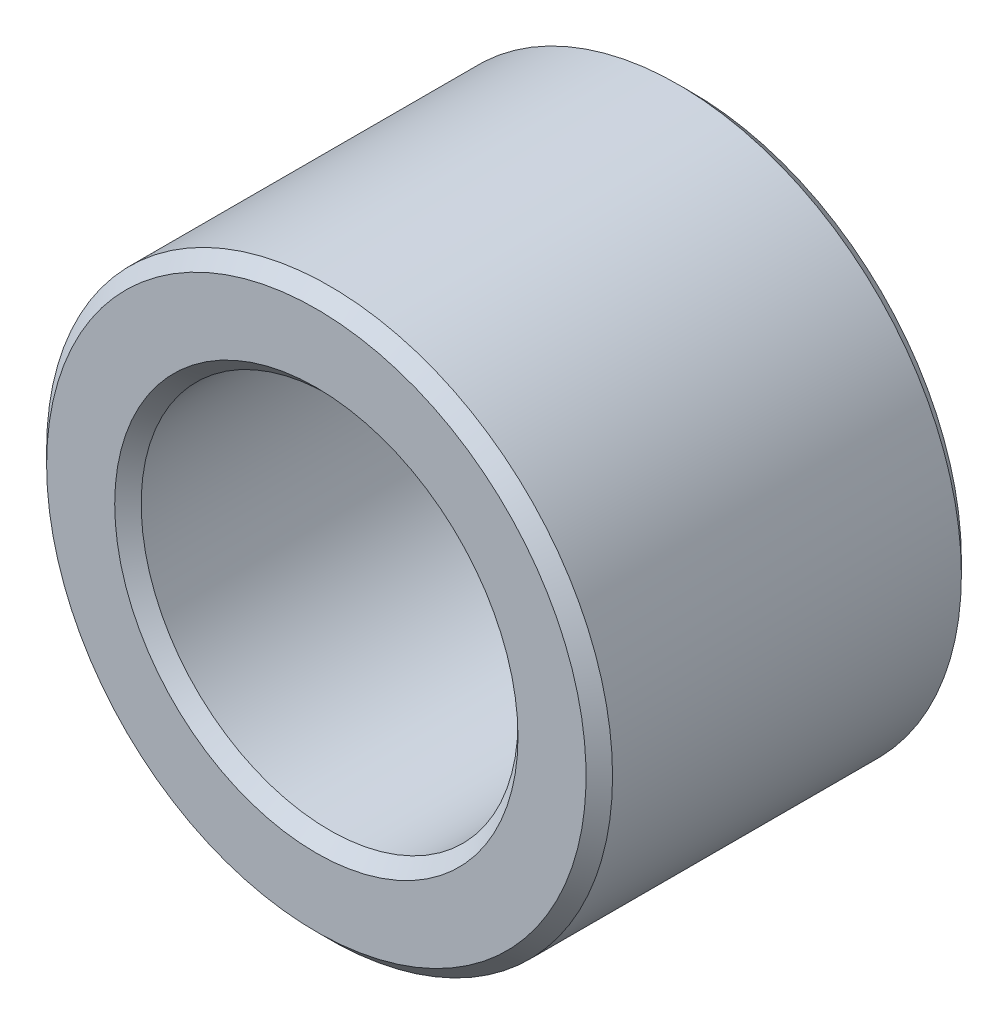
ISO-10303-21;
HEADER;
FILE_DESCRIPTION(('STEP AP214'),'2;1');
FILE_NAME('part.step','',(''),(''),'','','');
FILE_SCHEMA(('AUTOMOTIVE_DESIGN { 1 0 10303 214 1 1 1 1 }'));
ENDSEC;
DATA;
#1=APPLICATION_CONTEXT('core data for automotive mechanical design processes');
#2=APPLICATION_PROTOCOL_DEFINITION('international standard','automotive_design',2000,#1);
#3=PRODUCT_CONTEXT('',#1,'mechanical');
#4=PRODUCT('Part','Part','',(#3));
#5=PRODUCT_RELATED_PRODUCT_CATEGORY('part','',(#4));
#6=PRODUCT_DEFINITION_FORMATION('','',#4);
#7=PRODUCT_DEFINITION_CONTEXT('part definition',#1,'design');
#8=PRODUCT_DEFINITION('design','',#6,#7);
#9=PRODUCT_DEFINITION_SHAPE('','',#8);
#10=(LENGTH_UNIT() NAMED_UNIT(*) SI_UNIT(.MILLI.,.METRE.));
#11=(NAMED_UNIT(*) PLANE_ANGLE_UNIT() SI_UNIT($,.RADIAN.));
#12=(NAMED_UNIT(*) SI_UNIT($,.STERADIAN.) SOLID_ANGLE_UNIT());
#13=UNCERTAINTY_MEASURE_WITH_UNIT(LENGTH_MEASURE(1.E-05),#10,'distance_accuracy_value','');
#14=(GEOMETRIC_REPRESENTATION_CONTEXT(3) GLOBAL_UNCERTAINTY_ASSIGNED_CONTEXT((#13)) GLOBAL_UNIT_ASSIGNED_CONTEXT((#10,
#11,#12)) REPRESENTATION_CONTEXT('',''));
#15=CARTESIAN_POINT('',(0.,0.,0.));
#16=DIRECTION('',(0.,0.,1.));
#17=DIRECTION('',(1.,0.,0.));
#18=AXIS2_PLACEMENT_3D('',#15,#16,#17);
#19=CARTESIAN_POINT('',(0.,0.,-3.175));
#20=DIRECTION('',(0.,0.,1.));
#21=DIRECTION('',(1.,0.,0.));
#22=AXIS2_PLACEMENT_3D('',#19,#20,#21);
#23=CYLINDRICAL_SURFACE('',#22,4.7879);
#24=CARTESIAN_POINT('',(0.,0.,-2.950972));
#25=DIRECTION('',(0.,0.,1.));
#26=DIRECTION('',(1.,0.,0.));
#27=AXIS2_PLACEMENT_3D('',#24,#25,#26);
#28=CIRCLE('',#27,4.7879);
#29=CARTESIAN_POINT('',(4.7879,0.,-2.950972));
#30=VERTEX_POINT('',#29);
#31=EDGE_CURVE('E76',#30,#30,#28,.T.);
#32=ORIENTED_EDGE('',*,*,#31,.T.);
#33=EDGE_LOOP('',(#32));
#34=FACE_BOUND('',#33,.T.);
#35=CARTESIAN_POINT('',(0.,0.,2.95097199999999));
#36=DIRECTION('',(0.,0.,1.));
#37=DIRECTION('',(1.,0.,0.));
#38=AXIS2_PLACEMENT_3D('',#35,#36,#37);
#39=CIRCLE('',#38,4.7879);
#40=CARTESIAN_POINT('',(-4.7879,0.,2.95097199999999));
#41=VERTEX_POINT('',#40);
#42=EDGE_CURVE('E82',#41,#41,#39,.F.);
#43=ORIENTED_EDGE('',*,*,#42,.T.);
#44=EDGE_LOOP('',(#43));
#45=FACE_BOUND('',#44,.T.);
#46=ADVANCED_FACE('F43',(#34,#45),#23,.T.);
#47=CARTESIAN_POINT('',(0.,0.,-3.175));
#48=DIRECTION('',(0.,0.,1.));
#49=DIRECTION('',(1.,0.,0.));
#50=AXIS2_PLACEMENT_3D('',#47,#48,#49);
#51=PLANE('',#50);
#52=CARTESIAN_POINT('',(0.,0.,-3.175));
#53=DIRECTION('',(0.,0.,1.));
#54=DIRECTION('',(1.,0.,0.));
#55=AXIS2_PLACEMENT_3D('',#52,#53,#54);
#56=CIRCLE('',#55,4.563872);
#57=CARTESIAN_POINT('',(4.563872,0.,-3.175));
#58=VERTEX_POINT('',#57);
#59=EDGE_CURVE('E67',#58,#58,#56,.F.);
#60=ORIENTED_EDGE('',*,*,#59,.T.);
#61=EDGE_LOOP('',(#60));
#62=FACE_BOUND('',#61,.T.);
#63=CARTESIAN_POINT('',(0.,0.,-3.175));
#64=DIRECTION('',(0.,0.,1.));
#65=DIRECTION('',(1.,0.,0.));
#66=AXIS2_PLACEMENT_3D('',#63,#64,#65);
#67=CIRCLE('',#66,3.411728);
#68=CARTESIAN_POINT('',(3.411728,0.,-3.175));
#69=VERTEX_POINT('',#68);
#70=EDGE_CURVE('E72',#69,#69,#67,.T.);
#71=ORIENTED_EDGE('',*,*,#70,.T.);
#72=EDGE_LOOP('',(#71));
#73=FACE_BOUND('',#72,.T.);
#74=ADVANCED_FACE('F96',(#62,#73),#51,.F.);
#75=CARTESIAN_POINT('',(0.,0.,-3.175));
#76=DIRECTION('',(0.,0.,1.));
#77=DIRECTION('',(1.,0.,0.));
#78=AXIS2_PLACEMENT_3D('',#75,#76,#77);
#79=CYLINDRICAL_SURFACE('',#78,3.1877);
#80=CARTESIAN_POINT('',(0.,0.,-2.950972));
#81=DIRECTION('',(0.,0.,1.));
#82=DIRECTION('',(1.,0.,0.));
#83=AXIS2_PLACEMENT_3D('',#80,#81,#82);
#84=CIRCLE('',#83,3.1877);
#85=CARTESIAN_POINT('',(3.1877,0.,-2.950972));
#86=VERTEX_POINT('',#85);
#87=EDGE_CURVE('E59',#86,#86,#84,.F.);
#88=ORIENTED_EDGE('',*,*,#87,.T.);
#89=EDGE_LOOP('',(#88));
#90=FACE_BOUND('',#89,.T.);
#91=CARTESIAN_POINT('',(0.,0.,2.950972));
#92=DIRECTION('',(0.,0.,1.));
#93=DIRECTION('',(1.,0.,0.));
#94=AXIS2_PLACEMENT_3D('',#91,#92,#93);
#95=CIRCLE('',#94,3.1877);
#96=CARTESIAN_POINT('',(3.1877,0.,2.950972));
#97=VERTEX_POINT('',#96);
#98=EDGE_CURVE('E63',#97,#97,#95,.T.);
#99=ORIENTED_EDGE('',*,*,#98,.T.);
#100=EDGE_LOOP('',(#99));
#101=FACE_BOUND('',#100,.T.);
#102=ADVANCED_FACE('F104',(#90,#101),#79,.F.);
#103=CARTESIAN_POINT('',(0.,0.,3.175));
#104=DIRECTION('',(0.,0.,1.));
#105=DIRECTION('',(1.,0.,0.));
#106=AXIS2_PLACEMENT_3D('',#103,#104,#105);
#107=PLANE('',#106);
#108=CARTESIAN_POINT('',(0.,0.,3.175));
#109=DIRECTION('',(0.,0.,1.));
#110=DIRECTION('',(1.,0.,0.));
#111=AXIS2_PLACEMENT_3D('',#108,#109,#110);
#112=CIRCLE('',#111,3.411728);
#113=CARTESIAN_POINT('',(3.411728,0.,3.175));
#114=VERTEX_POINT('',#113);
#115=EDGE_CURVE('E10',#114,#114,#112,.F.);
#116=ORIENTED_EDGE('',*,*,#115,.T.);
#117=EDGE_LOOP('',(#116));
#118=FACE_BOUND('',#117,.T.);
#119=CARTESIAN_POINT('',(0.,0.,3.175));
#120=DIRECTION('',(0.,0.,1.));
#121=DIRECTION('',(1.,0.,0.));
#122=AXIS2_PLACEMENT_3D('',#119,#120,#121);
#123=CIRCLE('',#122,4.56387199999999);
#124=CARTESIAN_POINT('',(-4.56387199999999,0.,3.175));
#125=VERTEX_POINT('',#124);
#126=EDGE_CURVE('E55',#125,#125,#123,.T.);
#127=ORIENTED_EDGE('',*,*,#126,.T.);
#128=EDGE_LOOP('',(#127));
#129=FACE_BOUND('',#128,.T.);
#130=ADVANCED_FACE('F116',(#118,#129),#107,.T.);
#131=CARTESIAN_POINT('',(0.,0.,-2.950972));
#132=DIRECTION('',(0.,0.,1.));
#133=DIRECTION('',(1.,0.,0.));
#134=AXIS2_PLACEMENT_3D('',#131,#132,#133);
#135=CONICAL_SURFACE('',#134,4.7879,0.785398163397448);
#136=ORIENTED_EDGE('',*,*,#59,.F.);
#137=EDGE_LOOP('',(#136));
#138=FACE_BOUND('',#137,.T.);
#139=ORIENTED_EDGE('',*,*,#31,.F.);
#140=EDGE_LOOP('',(#139));
#141=FACE_BOUND('',#140,.T.);
#142=ADVANCED_FACE('F109',(#138,#141),#135,.T.);
#143=CARTESIAN_POINT('',(0.,0.,-3.175));
#144=DIRECTION('',(0.,0.,-1.));
#145=DIRECTION('',(-1.,0.,0.));
#146=AXIS2_PLACEMENT_3D('',#143,#144,#145);
#147=CONICAL_SURFACE('',#146,3.411728,0.785398163397447);
#148=ORIENTED_EDGE('',*,*,#87,.F.);
#149=EDGE_LOOP('',(#148));
#150=FACE_BOUND('',#149,.T.);
#151=ORIENTED_EDGE('',*,*,#70,.F.);
#152=EDGE_LOOP('',(#151));
#153=FACE_BOUND('',#152,.T.);
#154=ADVANCED_FACE('F94',(#150,#153),#147,.F.);
#155=CARTESIAN_POINT('',(0.,0.,2.950972));
#156=DIRECTION('',(0.,0.,1.));
#157=DIRECTION('',(1.,0.,0.));
#158=AXIS2_PLACEMENT_3D('',#155,#156,#157);
#159=CONICAL_SURFACE('',#158,3.1877,0.78539816339745);
#160=CARTESIAN_POINT('',(3.411728,0.,3.175));
#161=CARTESIAN_POINT('',(3.409394375,0.,3.172666375));
#162=CARTESIAN_POINT('',(3.40706075,0.,3.17033275));
#163=CARTESIAN_POINT('',(3.4023935,0.,3.1656655));
#164=CARTESIAN_POINT('',(3.400059875,0.,3.163331875));
#165=CARTESIAN_POINT('',(3.395392625,0.,3.158664625));
#166=CARTESIAN_POINT('',(3.393059,0.,3.156331));
#167=CARTESIAN_POINT('',(3.38839175,0.,3.15166375));
#168=CARTESIAN_POINT('',(3.386058125,0.,3.149330125));
#169=CARTESIAN_POINT('',(3.381390875,0.,3.144662875));
#170=CARTESIAN_POINT('',(3.37905725,0.,3.14232925));
#171=CARTESIAN_POINT('',(3.37439,0.,3.137662));
#172=CARTESIAN_POINT('',(3.372056375,0.,3.135328375));
#173=CARTESIAN_POINT('',(3.367389125,0.,3.130661125));
#174=CARTESIAN_POINT('',(3.3650555,0.,3.1283275));
#175=CARTESIAN_POINT('',(3.36038825,0.,3.12366025));
#176=CARTESIAN_POINT('',(3.358054625,0.,3.121326625));
#177=CARTESIAN_POINT('',(3.353387375,0.,3.116659375));
#178=CARTESIAN_POINT('',(3.35105375,0.,3.11432575));
#179=CARTESIAN_POINT('',(3.3463865,0.,3.1096585));
#180=CARTESIAN_POINT('',(3.344052875,0.,3.107324875));
#181=CARTESIAN_POINT('',(3.339385625,0.,3.102657625));
#182=CARTESIAN_POINT('',(3.337052,0.,3.100324));
#183=CARTESIAN_POINT('',(3.33238475,0.,3.09565675));
#184=CARTESIAN_POINT('',(3.330051125,0.,3.093323125));
#185=CARTESIAN_POINT('',(3.325383875,0.,3.088655875));
#186=CARTESIAN_POINT('',(3.32305025,0.,3.08632225));
#187=CARTESIAN_POINT('',(3.318383,0.,3.081655));
#188=CARTESIAN_POINT('',(3.316049375,0.,3.079321375));
#189=CARTESIAN_POINT('',(3.311382125,0.,3.074654125));
#190=CARTESIAN_POINT('',(3.3090485,0.,3.0723205));
#191=CARTESIAN_POINT('',(3.30438125,0.,3.06765325));
#192=CARTESIAN_POINT('',(3.302047625,0.,3.065319625));
#193=CARTESIAN_POINT('',(3.297380375,0.,3.060652375));
#194=CARTESIAN_POINT('',(3.29504675,0.,3.05831875));
#195=CARTESIAN_POINT('',(3.2903795,0.,3.0536515));
#196=CARTESIAN_POINT('',(3.288045875,0.,3.051317875));
#197=CARTESIAN_POINT('',(3.283378625,0.,3.046650625));
#198=CARTESIAN_POINT('',(3.281045,0.,3.044317));
#199=CARTESIAN_POINT('',(3.27637775,0.,3.03964975));
#200=CARTESIAN_POINT('',(3.274044125,0.,3.037316125));
#201=CARTESIAN_POINT('',(3.269376875,0.,3.032648875));
#202=CARTESIAN_POINT('',(3.26704325,0.,3.03031525));
#203=CARTESIAN_POINT('',(3.262376,0.,3.025648));
#204=CARTESIAN_POINT('',(3.260042375,0.,3.023314375));
#205=CARTESIAN_POINT('',(3.255375125,0.,3.018647125));
#206=CARTESIAN_POINT('',(3.2530415,0.,3.0163135));
#207=CARTESIAN_POINT('',(3.24837425,0.,3.01164625));
#208=CARTESIAN_POINT('',(3.246040625,0.,3.009312625));
#209=CARTESIAN_POINT('',(3.241373375,0.,3.004645375));
#210=CARTESIAN_POINT('',(3.23903975,0.,3.00231175));
#211=CARTESIAN_POINT('',(3.2343725,0.,2.9976445));
#212=CARTESIAN_POINT('',(3.232038875,0.,2.995310875));
#213=CARTESIAN_POINT('',(3.227371625,0.,2.990643625));
#214=CARTESIAN_POINT('',(3.225038,0.,2.98831));
#215=CARTESIAN_POINT('',(3.22037075,0.,2.98364275));
#216=CARTESIAN_POINT('',(3.218037125,0.,2.981309125));
#217=CARTESIAN_POINT('',(3.213369875,0.,2.976641875));
#218=CARTESIAN_POINT('',(3.21103625,0.,2.97430825));
#219=CARTESIAN_POINT('',(3.206369,0.,2.969641));
#220=CARTESIAN_POINT('',(3.204035375,0.,2.967307375));
#221=CARTESIAN_POINT('',(3.199368125,0.,2.962640125));
#222=CARTESIAN_POINT('',(3.1970345,0.,2.9603065));
#223=CARTESIAN_POINT('',(3.19236725,0.,2.95563925));
#224=CARTESIAN_POINT('',(3.190033625,0.,2.953305625));
#225=CARTESIAN_POINT('',(3.1877,0.,2.950972));
#226=B_SPLINE_CURVE_WITH_KNOTS('',3,(#160,#161,#162,#163,#164,#165,#166,#167,#168,#169,#170,
#171,#172,#173,#174,#175,#176,#177,#178,#179,#180,#181,#182,#183,#184,#185,#186,#187,#188,#189,
#190,#191,#192,#193,#194,#195,#196,#197,#198,#199,#200,#201,#202,#203,#204,#205,#206,#207,#208,
#209,#210,#211,#212,#213,#214,#215,#216,#217,#218,#219,#220,#221,#222,#223,#224,#225),
.UNSPECIFIED.,.F.,.F.,(4,2,2,2,2,2,2,2,2,2,2,2,2,2,2,2,2,2,2,2,2,2,2,2,2,2,2,2,2,2,2,2,4),(0.,
0.0099007323734791,0.0198014647469579,0.0297021971204367,0.0396029294939155,0.0495036618673943,
0.0594043942408734,0.0693051266143521,0.0792058589878312,0.08910659136131,0.0990073237347888,
0.108908056108268,0.118808788481747,0.128709520855225,0.138610253228704,0.148510985602183,
0.158411717975662,0.168312450349141,0.17821318272262,0.188113915096099,0.198014647469578,
0.207915379843056,0.217816112216536,0.227716844590014,0.237617576963493,0.247518309336972,
0.257419041710451,0.26731977408393,0.277220506457409,0.287121238830888,0.297021971204366,
0.306922703577845,0.316823435951324),.UNSPECIFIED.);
#227=EDGE_CURVE('BSEAM93',#114,#97,#226,.T.);
#228=ORIENTED_EDGE('',*,*,#115,.F.);
#229=ORIENTED_EDGE('',*,*,#98,.F.);
#230=ORIENTED_EDGE('',*,*,#227,.T.);
#231=ORIENTED_EDGE('',*,*,#227,.F.);
#232=EDGE_LOOP('',(#228,#230,#229,#231));
#233=FACE_BOUND('',#232,.T.);
#234=ADVANCED_FACE('F93',(#233),#159,.F.);
#235=CARTESIAN_POINT('',(0.,0.,3.175));
#236=DIRECTION('',(0.,0.,-1.));
#237=DIRECTION('',(-1.,0.,0.));
#238=AXIS2_PLACEMENT_3D('',#235,#236,#237);
#239=CONICAL_SURFACE('',#238,4.56387199999999,0.785398163397446);
#240=CARTESIAN_POINT('',(-4.7879,0.,2.95097199999999));
#241=CARTESIAN_POINT('',(-4.785566375,0.,2.95330562499999));
#242=CARTESIAN_POINT('',(-4.78323275,0.,2.95563924999999));
#243=CARTESIAN_POINT('',(-4.7785655,0.,2.96030649999999));
#244=CARTESIAN_POINT('',(-4.776231875,0.,2.96264012499999));
#245=CARTESIAN_POINT('',(-4.771564625,0.,2.96730737499999));
#246=CARTESIAN_POINT('',(-4.769231,0.,2.96964099999999));
#247=CARTESIAN_POINT('',(-4.76456375,0.,2.97430824999999));
#248=CARTESIAN_POINT('',(-4.762230125,0.,2.97664187499999));
#249=CARTESIAN_POINT('',(-4.757562875,0.,2.98130912499999));
#250=CARTESIAN_POINT('',(-4.75522925,0.,2.98364274999999));
#251=CARTESIAN_POINT('',(-4.750562,0.,2.98830999999999));
#252=CARTESIAN_POINT('',(-4.748228375,0.,2.99064362499999));
#253=CARTESIAN_POINT('',(-4.743561125,0.,2.99531087499999));
#254=CARTESIAN_POINT('',(-4.7412275,0.,2.99764449999999));
#255=CARTESIAN_POINT('',(-4.73656025,0.,3.00231174999999));
#256=CARTESIAN_POINT('',(-4.734226625,0.,3.00464537499999));
#257=CARTESIAN_POINT('',(-4.729559375,0.,3.00931262499999));
#258=CARTESIAN_POINT('',(-4.72722575,0.,3.01164624999999));
#259=CARTESIAN_POINT('',(-4.7225585,0.,3.01631349999999));
#260=CARTESIAN_POINT('',(-4.720224875,0.,3.01864712499999));
#261=CARTESIAN_POINT('',(-4.715557625,0.,3.02331437499999));
#262=CARTESIAN_POINT('',(-4.713224,0.,3.02564799999999));
#263=CARTESIAN_POINT('',(-4.70855675,0.,3.03031524999999));
#264=CARTESIAN_POINT('',(-4.706223125,0.,3.032648875));
#265=CARTESIAN_POINT('',(-4.701555875,0.,3.03731612499999));
#266=CARTESIAN_POINT('',(-4.69922225,0.,3.03964974999999));
#267=CARTESIAN_POINT('',(-4.694555,0.,3.044317));
#268=CARTESIAN_POINT('',(-4.692221375,0.,3.046650625));
#269=CARTESIAN_POINT('',(-4.687554125,0.,3.051317875));
#270=CARTESIAN_POINT('',(-4.6852205,0.,3.0536515));
#271=CARTESIAN_POINT('',(-4.68055325,0.,3.05831875));
#272=CARTESIAN_POINT('',(-4.678219625,0.,3.060652375));
#273=CARTESIAN_POINT('',(-4.673552375,0.,3.065319625));
#274=CARTESIAN_POINT('',(-4.67121875,0.,3.06765325));
#275=CARTESIAN_POINT('',(-4.6665515,0.,3.0723205));
#276=CARTESIAN_POINT('',(-4.664217875,0.,3.074654125));
#277=CARTESIAN_POINT('',(-4.659550625,0.,3.079321375));
#278=CARTESIAN_POINT('',(-4.657217,0.,3.081655));
#279=CARTESIAN_POINT('',(-4.65254975,0.,3.08632225));
#280=CARTESIAN_POINT('',(-4.650216125,0.,3.088655875));
#281=CARTESIAN_POINT('',(-4.645548875,0.,3.093323125));
#282=CARTESIAN_POINT('',(-4.64321525,0.,3.09565675));
#283=CARTESIAN_POINT('',(-4.638548,0.,3.100324));
#284=CARTESIAN_POINT('',(-4.636214375,0.,3.102657625));
#285=CARTESIAN_POINT('',(-4.631547125,0.,3.107324875));
#286=CARTESIAN_POINT('',(-4.6292135,0.,3.1096585));
#287=CARTESIAN_POINT('',(-4.62454625,0.,3.11432575));
#288=CARTESIAN_POINT('',(-4.622212625,0.,3.116659375));
#289=CARTESIAN_POINT('',(-4.617545375,0.,3.121326625));
#290=CARTESIAN_POINT('',(-4.61521175,0.,3.12366025));
#291=CARTESIAN_POINT('',(-4.6105445,0.,3.1283275));
#292=CARTESIAN_POINT('',(-4.608210875,0.,3.130661125));
#293=CARTESIAN_POINT('',(-4.603543625,0.,3.135328375));
#294=CARTESIAN_POINT('',(-4.60121,0.,3.137662));
#295=CARTESIAN_POINT('',(-4.59654275,0.,3.14232925));
#296=CARTESIAN_POINT('',(-4.594209125,0.,3.144662875));
#297=CARTESIAN_POINT('',(-4.589541875,0.,3.149330125));
#298=CARTESIAN_POINT('',(-4.58720825,0.,3.15166375));
#299=CARTESIAN_POINT('',(-4.582541,0.,3.156331));
#300=CARTESIAN_POINT('',(-4.580207375,0.,3.158664625));
#301=CARTESIAN_POINT('',(-4.575540125,0.,3.163331875));
#302=CARTESIAN_POINT('',(-4.5732065,0.,3.1656655));
#303=CARTESIAN_POINT('',(-4.56853925,0.,3.17033275));
#304=CARTESIAN_POINT('',(-4.56620562499999,0.,3.172666375));
#305=CARTESIAN_POINT('',(-4.56387199999999,0.,3.175));
#306=B_SPLINE_CURVE_WITH_KNOTS('',3,(#240,#241,#242,#243,#244,#245,#246,#247,#248,#249,#250,
#251,#252,#253,#254,#255,#256,#257,#258,#259,#260,#261,#262,#263,#264,#265,#266,#267,#268,#269,
#270,#271,#272,#273,#274,#275,#276,#277,#278,#279,#280,#281,#282,#283,#284,#285,#286,#287,#288,
#289,#290,#291,#292,#293,#294,#295,#296,#297,#298,#299,#300,#301,#302,#303,#304,#305),
.UNSPECIFIED.,.F.,.F.,(4,2,2,2,2,2,2,2,2,2,2,2,2,2,2,2,2,2,2,2,2,2,2,2,2,2,2,2,2,2,2,2,4),(0.,
0.00990073237347879,0.0198014647469579,0.0297021971204373,0.0396029294939158,0.0495036618673949,
0.0594043942408743,0.0693051266143528,0.0792058589878319,0.0891065913613113,0.0990073237347898,
0.108908056108269,0.118808788481748,0.128709520855227,0.138610253228706,0.148510985602185,
0.158411717975664,0.168312450349143,0.178213182722622,0.188113915096101,0.19801464746958,
0.207915379843059,0.217816112216538,0.227716844590017,0.237617576963496,0.247518309336975,
0.257419041710454,0.267319774083933,0.277220506457412,0.287121238830891,0.29702197120437,
0.306922703577849,0.316823435951328),.UNSPECIFIED.);
#307=EDGE_CURVE('BSEAM46',#41,#125,#306,.T.);
#308=ORIENTED_EDGE('',*,*,#42,.F.);
#309=ORIENTED_EDGE('',*,*,#126,.F.);
#310=ORIENTED_EDGE('',*,*,#307,.T.);
#311=ORIENTED_EDGE('',*,*,#307,.F.);
#312=EDGE_LOOP('',(#308,#310,#309,#311));
#313=FACE_BOUND('',#312,.T.);
#314=ADVANCED_FACE('F46',(#313),#239,.T.);
#315=CLOSED_SHELL('',(#46,#74,#102,#130,#142,#154,#234,#314));
#316=MANIFOLD_SOLID_BREP('B2',#315);
#317=ADVANCED_BREP_SHAPE_REPRESENTATION('',(#18,#316),#14);
#318=SHAPE_DEFINITION_REPRESENTATION(#9,#317);
ENDSEC;
END-ISO-10303-21;
